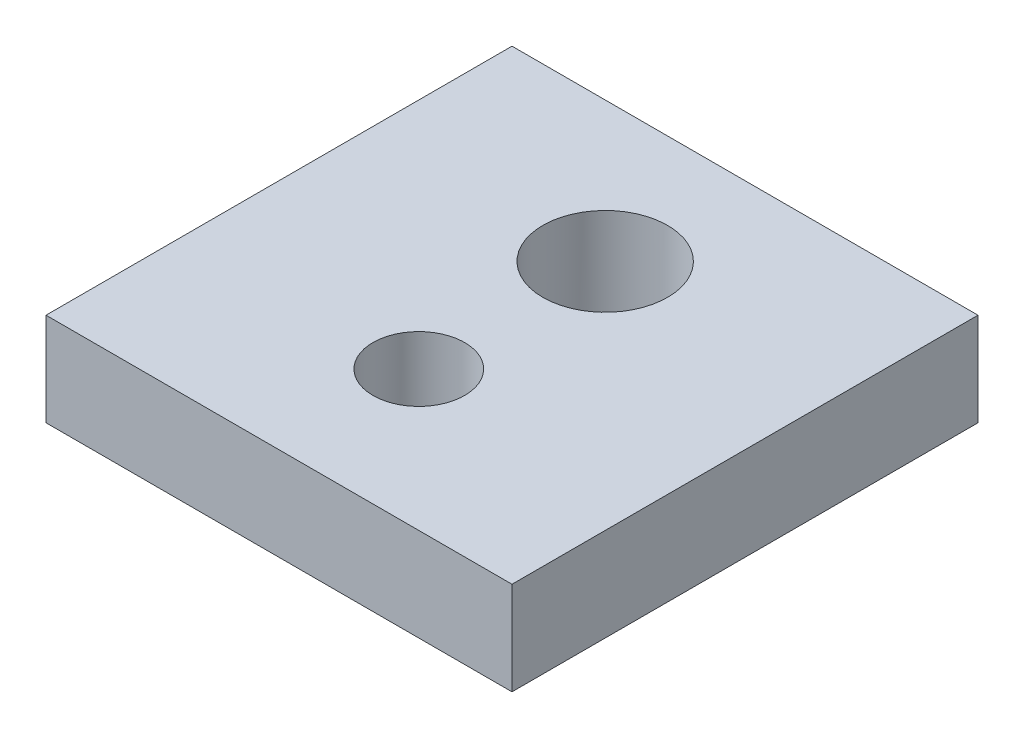
ISO-10303-21;
HEADER;
FILE_DESCRIPTION(('STEP AP214'),'2;1');
FILE_NAME('part.step','',(''),(''),'','','');
FILE_SCHEMA(('AUTOMOTIVE_DESIGN { 1 0 10303 214 1 1 1 1 }'));
ENDSEC;
DATA;
#1=APPLICATION_CONTEXT('core data for automotive mechanical design processes');
#2=APPLICATION_PROTOCOL_DEFINITION('international standard','automotive_design',2000,#1);
#3=PRODUCT_CONTEXT('',#1,'mechanical');
#4=PRODUCT('Part','Part','',(#3));
#5=PRODUCT_RELATED_PRODUCT_CATEGORY('part','',(#4));
#6=PRODUCT_DEFINITION_FORMATION('','',#4);
#7=PRODUCT_DEFINITION_CONTEXT('part definition',#1,'design');
#8=PRODUCT_DEFINITION('design','',#6,#7);
#9=PRODUCT_DEFINITION_SHAPE('','',#8);
#10=(LENGTH_UNIT() NAMED_UNIT(*) SI_UNIT(.MILLI.,.METRE.));
#11=(NAMED_UNIT(*) PLANE_ANGLE_UNIT() SI_UNIT($,.RADIAN.));
#12=(NAMED_UNIT(*) SI_UNIT($,.STERADIAN.) SOLID_ANGLE_UNIT());
#13=UNCERTAINTY_MEASURE_WITH_UNIT(LENGTH_MEASURE(1.E-05),#10,'distance_accuracy_value','');
#14=(GEOMETRIC_REPRESENTATION_CONTEXT(3) GLOBAL_UNCERTAINTY_ASSIGNED_CONTEXT((#13)) GLOBAL_UNIT_ASSIGNED_CONTEXT((#10,
#11,#12)) REPRESENTATION_CONTEXT('',''));
#15=CARTESIAN_POINT('',(0.,0.,0.));
#16=DIRECTION('',(0.,0.,1.));
#17=DIRECTION('',(1.,0.,0.));
#18=AXIS2_PLACEMENT_3D('',#15,#16,#17);
#19=CARTESIAN_POINT('',(0.,2.54,0.));
#20=DIRECTION('',(0.,-1.,0.));
#21=DIRECTION('',(0.,0.,-1.));
#22=AXIS2_PLACEMENT_3D('',#19,#20,#21);
#23=PLANE('',#22);
#24=CARTESIAN_POINT('',(0.,2.54,2.54));
#25=DIRECTION('',(0.,1.,0.));
#26=DIRECTION('',(0.,0.,1.));
#27=AXIS2_PLACEMENT_3D('',#24,#25,#26);
#28=CIRCLE('',#27,1.25);
#29=CARTESIAN_POINT('',(0.,2.54,3.79));
#30=VERTEX_POINT('',#29);
#31=EDGE_CURVE('E141',#30,#30,#28,.T.);
#32=ORIENTED_EDGE('',*,*,#31,.F.);
#33=EDGE_LOOP('',(#32));
#34=FACE_BOUND('',#33,.T.);
#35=DIRECTION('',(0.,0.,-1.));
#36=VECTOR('',#35,1.);
#37=CARTESIAN_POINT('',(6.35,2.54,6.35));
#38=LINE('',#37,#36);
#39=CARTESIAN_POINT('',(6.35,2.54,6.35));
#40=VERTEX_POINT('',#39);
#41=CARTESIAN_POINT('',(6.35,2.54,-6.35));
#42=VERTEX_POINT('',#41);
#43=EDGE_CURVE('E92',#40,#42,#38,.T.);
#44=ORIENTED_EDGE('',*,*,#43,.T.);
#45=DIRECTION('',(-1.,0.,0.));
#46=VECTOR('',#45,1.);
#47=CARTESIAN_POINT('',(-6.35,2.54,-6.35));
#48=LINE('',#47,#46);
#49=CARTESIAN_POINT('',(-6.35,2.54,-6.35));
#50=VERTEX_POINT('',#49);
#51=EDGE_CURVE('E87',#42,#50,#48,.T.);
#52=ORIENTED_EDGE('',*,*,#51,.T.);
#53=DIRECTION('',(0.,0.,1.));
#54=VECTOR('',#53,1.);
#55=CARTESIAN_POINT('',(-6.35,2.54,6.35));
#56=LINE('',#55,#54);
#57=CARTESIAN_POINT('',(-6.35,2.54,6.35));
#58=VERTEX_POINT('',#57);
#59=EDGE_CURVE('E90',#50,#58,#56,.T.);
#60=ORIENTED_EDGE('',*,*,#59,.T.);
#61=DIRECTION('',(1.,0.,0.));
#62=VECTOR('',#61,1.);
#63=CARTESIAN_POINT('',(-6.35,2.54,6.35));
#64=LINE('',#63,#62);
#65=EDGE_CURVE('E57',#58,#40,#64,.T.);
#66=ORIENTED_EDGE('',*,*,#65,.T.);
#67=EDGE_LOOP('',(#44,#52,#60,#66));
#68=FACE_BOUND('',#67,.T.);
#69=CARTESIAN_POINT('',(0.,2.54,-2.54));
#70=DIRECTION('',(0.,1.,0.));
#71=DIRECTION('',(0.,0.,1.));
#72=AXIS2_PLACEMENT_3D('',#69,#70,#71);
#73=CIRCLE('',#72,1.7);
#74=CARTESIAN_POINT('',(0.,2.54,-0.840000000000003));
#75=VERTEX_POINT('',#74);
#76=EDGE_CURVE('E133',#75,#75,#73,.T.);
#77=ORIENTED_EDGE('',*,*,#76,.F.);
#78=EDGE_LOOP('',(#77));
#79=FACE_BOUND('',#78,.T.);
#80=ADVANCED_FACE('F39',(#34,#68,#79),#23,.F.);
#81=CARTESIAN_POINT('',(0.,0.,0.));
#82=DIRECTION('',(0.,-1.,0.));
#83=DIRECTION('',(0.,0.,-1.));
#84=AXIS2_PLACEMENT_3D('',#81,#82,#83);
#85=PLANE('',#84);
#86=CARTESIAN_POINT('',(0.,0.,2.54));
#87=DIRECTION('',(0.,-1.,0.));
#88=DIRECTION('',(0.,0.,-1.));
#89=AXIS2_PLACEMENT_3D('',#86,#87,#88);
#90=CIRCLE('',#89,1.25);
#91=CARTESIAN_POINT('',(0.,0.,1.29));
#92=VERTEX_POINT('',#91);
#93=EDGE_CURVE('E137',#92,#92,#90,.F.);
#94=ORIENTED_EDGE('',*,*,#93,.T.);
#95=EDGE_LOOP('',(#94));
#96=FACE_BOUND('',#95,.T.);
#97=DIRECTION('',(0.,0.,-1.));
#98=VECTOR('',#97,1.);
#99=CARTESIAN_POINT('',(6.35,0.,6.35));
#100=LINE('',#99,#98);
#101=CARTESIAN_POINT('',(6.35,0.,6.35));
#102=VERTEX_POINT('',#101);
#103=CARTESIAN_POINT('',(6.35,0.,-6.35));
#104=VERTEX_POINT('',#103);
#105=EDGE_CURVE('E108',#102,#104,#100,.T.);
#106=ORIENTED_EDGE('',*,*,#105,.F.);
#107=DIRECTION('',(1.,0.,0.));
#108=VECTOR('',#107,1.);
#109=CARTESIAN_POINT('',(-6.35,0.,6.35));
#110=LINE('',#109,#108);
#111=CARTESIAN_POINT('',(-6.35,0.,6.35));
#112=VERTEX_POINT('',#111);
#113=EDGE_CURVE('E80',#112,#102,#110,.T.);
#114=ORIENTED_EDGE('',*,*,#113,.F.);
#115=DIRECTION('',(0.,0.,1.));
#116=VECTOR('',#115,1.);
#117=CARTESIAN_POINT('',(-6.35,0.,6.35));
#118=LINE('',#117,#116);
#119=CARTESIAN_POINT('',(-6.35,0.,-6.35));
#120=VERTEX_POINT('',#119);
#121=EDGE_CURVE('E74',#120,#112,#118,.T.);
#122=ORIENTED_EDGE('',*,*,#121,.F.);
#123=DIRECTION('',(-1.,0.,0.));
#124=VECTOR('',#123,1.);
#125=CARTESIAN_POINT('',(-6.35,0.,-6.35));
#126=LINE('',#125,#124);
#127=EDGE_CURVE('E97',#104,#120,#126,.T.);
#128=ORIENTED_EDGE('',*,*,#127,.F.);
#129=EDGE_LOOP('',(#106,#114,#122,#128));
#130=FACE_BOUND('',#129,.T.);
#131=CARTESIAN_POINT('',(0.,0.,-2.54));
#132=DIRECTION('',(0.,-1.,0.));
#133=DIRECTION('',(0.,0.,-1.));
#134=AXIS2_PLACEMENT_3D('',#131,#132,#133);
#135=CIRCLE('',#134,1.7);
#136=CARTESIAN_POINT('',(0.,0.,-4.24));
#137=VERTEX_POINT('',#136);
#138=EDGE_CURVE('E112',#137,#137,#135,.F.);
#139=ORIENTED_EDGE('',*,*,#138,.T.);
#140=EDGE_LOOP('',(#139));
#141=FACE_BOUND('',#140,.T.);
#142=ADVANCED_FACE('F125',(#96,#130,#141),#85,.T.);
#143=CARTESIAN_POINT('',(6.35,2.54,6.35));
#144=DIRECTION('',(-1.,0.,0.));
#145=DIRECTION('',(0.,0.,1.));
#146=AXIS2_PLACEMENT_3D('',#143,#144,#145);
#147=PLANE('',#146);
#148=ORIENTED_EDGE('',*,*,#105,.T.);
#149=DIRECTION('',(0.,-1.,0.));
#150=VECTOR('',#149,1.);
#151=CARTESIAN_POINT('',(6.35,2.54,-6.35));
#152=LINE('',#151,#150);
#153=EDGE_CURVE('E11',#42,#104,#152,.T.);
#154=ORIENTED_EDGE('',*,*,#153,.F.);
#155=ORIENTED_EDGE('',*,*,#43,.F.);
#156=DIRECTION('',(0.,-1.,0.));
#157=VECTOR('',#156,1.);
#158=CARTESIAN_POINT('',(6.35,2.54,6.35));
#159=LINE('',#158,#157);
#160=EDGE_CURVE('E104',#40,#102,#159,.T.);
#161=ORIENTED_EDGE('',*,*,#160,.T.);
#162=EDGE_LOOP('',(#148,#154,#155,#161));
#163=FACE_BOUND('',#162,.T.);
#164=ADVANCED_FACE('F41',(#163),#147,.F.);
#165=CARTESIAN_POINT('',(-6.35,2.54,-6.35));
#166=DIRECTION('',(0.,0.,1.));
#167=DIRECTION('',(1.,0.,0.));
#168=AXIS2_PLACEMENT_3D('',#165,#166,#167);
#169=PLANE('',#168);
#170=ORIENTED_EDGE('',*,*,#127,.T.);
#171=DIRECTION('',(0.,-1.,0.));
#172=VECTOR('',#171,1.);
#173=CARTESIAN_POINT('',(-6.35,2.54,-6.35));
#174=LINE('',#173,#172);
#175=EDGE_CURVE('E49',#50,#120,#174,.T.);
#176=ORIENTED_EDGE('',*,*,#175,.F.);
#177=ORIENTED_EDGE('',*,*,#51,.F.);
#178=ORIENTED_EDGE('',*,*,#153,.T.);
#179=EDGE_LOOP('',(#170,#176,#177,#178));
#180=FACE_BOUND('',#179,.T.);
#181=ADVANCED_FACE('F96',(#180),#169,.F.);
#182=CARTESIAN_POINT('',(-6.35,2.54,6.35));
#183=DIRECTION('',(1.,0.,0.));
#184=DIRECTION('',(0.,0.,-1.));
#185=AXIS2_PLACEMENT_3D('',#182,#183,#184);
#186=PLANE('',#185);
#187=ORIENTED_EDGE('',*,*,#121,.T.);
#188=DIRECTION('',(0.,-1.,0.));
#189=VECTOR('',#188,1.);
#190=CARTESIAN_POINT('',(-6.35,2.54,6.35));
#191=LINE('',#190,#189);
#192=EDGE_CURVE('E99',#58,#112,#191,.T.);
#193=ORIENTED_EDGE('',*,*,#192,.F.);
#194=ORIENTED_EDGE('',*,*,#59,.F.);
#195=ORIENTED_EDGE('',*,*,#175,.T.);
#196=EDGE_LOOP('',(#187,#193,#194,#195));
#197=FACE_BOUND('',#196,.T.);
#198=ADVANCED_FACE('F100',(#197),#186,.F.);
#199=CARTESIAN_POINT('',(-6.35,2.54,6.35));
#200=DIRECTION('',(0.,0.,-1.));
#201=DIRECTION('',(-1.,0.,0.));
#202=AXIS2_PLACEMENT_3D('',#199,#200,#201);
#203=PLANE('',#202);
#204=ORIENTED_EDGE('',*,*,#113,.T.);
#205=ORIENTED_EDGE('',*,*,#160,.F.);
#206=ORIENTED_EDGE('',*,*,#65,.F.);
#207=ORIENTED_EDGE('',*,*,#192,.T.);
#208=EDGE_LOOP('',(#204,#205,#206,#207));
#209=FACE_BOUND('',#208,.T.);
#210=ADVANCED_FACE('F122',(#209),#203,.F.);
#211=CARTESIAN_POINT('',(0.,2.54,-2.54));
#212=DIRECTION('',(0.,1.,0.));
#213=DIRECTION('',(0.,0.,1.));
#214=AXIS2_PLACEMENT_3D('',#211,#212,#213);
#215=CYLINDRICAL_SURFACE('',#214,1.7);
#216=ORIENTED_EDGE('',*,*,#138,.F.);
#217=EDGE_LOOP('',(#216));
#218=FACE_BOUND('',#217,.T.);
#219=ORIENTED_EDGE('',*,*,#76,.T.);
#220=EDGE_LOOP('',(#219));
#221=FACE_BOUND('',#220,.T.);
#222=ADVANCED_FACE('F156',(#218,#221),#215,.F.);
#223=CARTESIAN_POINT('',(0.,2.54,2.54));
#224=DIRECTION('',(0.,1.,0.));
#225=DIRECTION('',(0.,0.,1.));
#226=AXIS2_PLACEMENT_3D('',#223,#224,#225);
#227=CYLINDRICAL_SURFACE('',#226,1.25);
#228=ORIENTED_EDGE('',*,*,#93,.F.);
#229=EDGE_LOOP('',(#228));
#230=FACE_BOUND('',#229,.T.);
#231=ORIENTED_EDGE('',*,*,#31,.T.);
#232=EDGE_LOOP('',(#231));
#233=FACE_BOUND('',#232,.T.);
#234=ADVANCED_FACE('F146',(#230,#233),#227,.F.);
#235=CLOSED_SHELL('',(#80,#142,#164,#181,#198,#210,#222,#234));
#236=MANIFOLD_SOLID_BREP('B2',#235);
#237=ADVANCED_BREP_SHAPE_REPRESENTATION('',(#18,#236),#14);
#238=SHAPE_DEFINITION_REPRESENTATION(#9,#237);
ENDSEC;
END-ISO-10303-21;
